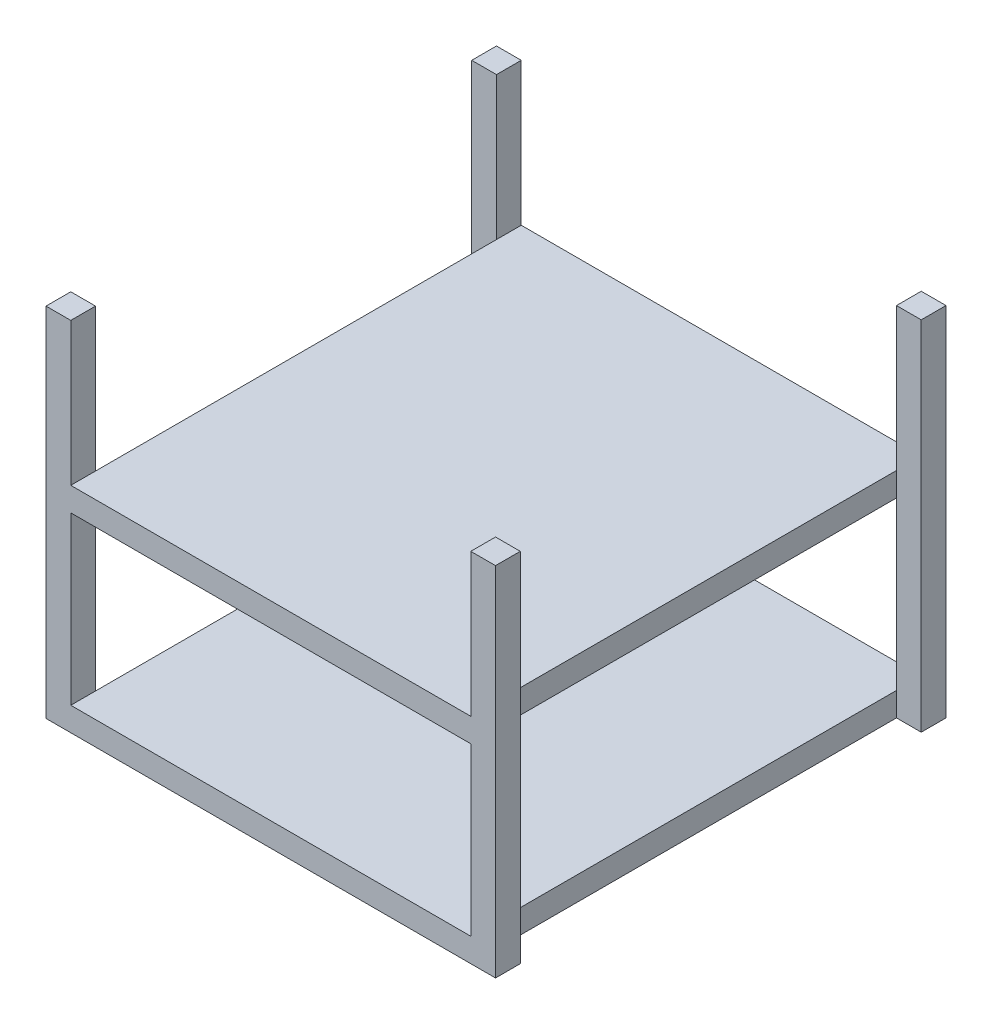
ISO-10303-21;
HEADER;
FILE_DESCRIPTION(('STEP AP214'),'2;1');
FILE_NAME('part.step','',(''),(''),'','','');
FILE_SCHEMA(('AUTOMOTIVE_DESIGN { 1 0 10303 214 1 1 1 1 }'));
ENDSEC;
DATA;
#1=APPLICATION_CONTEXT('core data for automotive mechanical design processes');
#2=APPLICATION_PROTOCOL_DEFINITION('international standard','automotive_design',2000,#1);
#3=PRODUCT_CONTEXT('',#1,'mechanical');
#4=PRODUCT('Part','Part','',(#3));
#5=PRODUCT_RELATED_PRODUCT_CATEGORY('part','',(#4));
#6=PRODUCT_DEFINITION_FORMATION('','',#4);
#7=PRODUCT_DEFINITION_CONTEXT('part definition',#1,'design');
#8=PRODUCT_DEFINITION('design','',#6,#7);
#9=PRODUCT_DEFINITION_SHAPE('','',#8);
#10=(LENGTH_UNIT() NAMED_UNIT(*) SI_UNIT(.MILLI.,.METRE.));
#11=(NAMED_UNIT(*) PLANE_ANGLE_UNIT() SI_UNIT($,.RADIAN.));
#12=(NAMED_UNIT(*) SI_UNIT($,.STERADIAN.) SOLID_ANGLE_UNIT());
#13=UNCERTAINTY_MEASURE_WITH_UNIT(LENGTH_MEASURE(1.E-05),#10,'distance_accuracy_value','');
#14=(GEOMETRIC_REPRESENTATION_CONTEXT(3) GLOBAL_UNCERTAINTY_ASSIGNED_CONTEXT((#13)) GLOBAL_UNIT_ASSIGNED_CONTEXT((#10,
#11,#12)) REPRESENTATION_CONTEXT('',''));
#15=CARTESIAN_POINT('',(0.,0.,0.));
#16=DIRECTION('',(0.,0.,1.));
#17=DIRECTION('',(1.,0.,0.));
#18=AXIS2_PLACEMENT_3D('',#15,#16,#17);
#19=CARTESIAN_POINT('',(0.,190.5,120.142));
#20=DIRECTION('',(0.,0.,1.));
#21=DIRECTION('',(1.,0.,0.));
#22=AXIS2_PLACEMENT_3D('',#19,#20,#21);
#23=PLANE('',#22);
#24=DIRECTION('',(-1.,0.,0.));
#25=VECTOR('',#24,1.);
#26=CARTESIAN_POINT('',(0.,114.3,120.142));
#27=LINE('',#26,#25);
#28=CARTESIAN_POINT('',(106.68,114.3,120.142));
#29=VERTEX_POINT('',#28);
#30=CARTESIAN_POINT('',(-106.68,114.3,120.142));
#31=VERTEX_POINT('',#30);
#32=EDGE_CURVE('E334',#29,#31,#27,.T.);
#33=ORIENTED_EDGE('',*,*,#32,.T.);
#34=DIRECTION('',(0.,1.,0.));
#35=VECTOR('',#34,1.);
#36=CARTESIAN_POINT('',(-106.68,0.,120.142));
#37=LINE('',#36,#35);
#38=CARTESIAN_POINT('',(-106.68,190.5,120.142));
#39=VERTEX_POINT('',#38);
#40=EDGE_CURVE('E341',#31,#39,#37,.T.);
#41=ORIENTED_EDGE('',*,*,#40,.T.);
#42=DIRECTION('',(-1.,0.,0.));
#43=VECTOR('',#42,1.);
#44=CARTESIAN_POINT('',(0.,190.5,120.142));
#45=LINE('',#44,#43);
#46=CARTESIAN_POINT('',(-119.888,190.5,120.142));
#47=VERTEX_POINT('',#46);
#48=EDGE_CURVE('E400',#39,#47,#45,.T.);
#49=ORIENTED_EDGE('',*,*,#48,.T.);
#50=DIRECTION('',(0.,-1.,0.));
#51=VECTOR('',#50,1.);
#52=CARTESIAN_POINT('',(-119.888,190.5,120.142));
#53=LINE('',#52,#51);
#54=CARTESIAN_POINT('',(-119.888,0.,120.142));
#55=VERTEX_POINT('',#54);
#56=EDGE_CURVE('E472',#47,#55,#53,.T.);
#57=ORIENTED_EDGE('',*,*,#56,.T.);
#58=DIRECTION('',(-1.,0.,0.));
#59=VECTOR('',#58,1.);
#60=CARTESIAN_POINT('',(0.,0.,120.142));
#61=LINE('',#60,#59);
#62=CARTESIAN_POINT('',(119.888,0.,120.142));
#63=VERTEX_POINT('',#62);
#64=EDGE_CURVE('E426',#63,#55,#61,.T.);
#65=ORIENTED_EDGE('',*,*,#64,.F.);
#66=DIRECTION('',(0.,-1.,0.));
#67=VECTOR('',#66,1.);
#68=CARTESIAN_POINT('',(119.888,190.5,120.142));
#69=LINE('',#68,#67);
#70=CARTESIAN_POINT('',(119.888,190.5,120.142));
#71=VERTEX_POINT('',#70);
#72=EDGE_CURVE('E119',#71,#63,#69,.T.);
#73=ORIENTED_EDGE('',*,*,#72,.F.);
#74=CARTESIAN_POINT('',(106.68,190.5,120.142));
#75=VERTEX_POINT('',#74);
#76=EDGE_CURVE('E402',#71,#75,#45,.T.);
#77=ORIENTED_EDGE('',*,*,#76,.T.);
#78=DIRECTION('',(0.,1.,0.));
#79=VECTOR('',#78,1.);
#80=CARTESIAN_POINT('',(106.68,0.,120.142));
#81=LINE('',#80,#79);
#82=EDGE_CURVE('E338',#29,#75,#81,.T.);
#83=ORIENTED_EDGE('',*,*,#82,.F.);
#84=EDGE_LOOP('',(#33,#41,#49,#57,#65,#73,#77,#83));
#85=FACE_BOUND('',#84,.T.);
#86=DIRECTION('',(0.,1.,0.));
#87=VECTOR('',#86,1.);
#88=CARTESIAN_POINT('',(-106.68,0.,120.142));
#89=LINE('',#88,#87);
#90=CARTESIAN_POINT('',(-106.68,12.7,120.142));
#91=VERTEX_POINT('',#90);
#92=CARTESIAN_POINT('',(-106.68,101.6,120.142));
#93=VERTEX_POINT('',#92);
#94=EDGE_CURVE('E307',#91,#93,#89,.T.);
#95=ORIENTED_EDGE('',*,*,#94,.T.);
#96=DIRECTION('',(1.,0.,0.));
#97=VECTOR('',#96,1.);
#98=CARTESIAN_POINT('',(0.,101.6,120.142));
#99=LINE('',#98,#97);
#100=CARTESIAN_POINT('',(106.68,101.6,120.142));
#101=VERTEX_POINT('',#100);
#102=EDGE_CURVE('E134',#93,#101,#99,.T.);
#103=ORIENTED_EDGE('',*,*,#102,.T.);
#104=DIRECTION('',(0.,1.,0.));
#105=VECTOR('',#104,1.);
#106=CARTESIAN_POINT('',(106.68,0.,120.142));
#107=LINE('',#106,#105);
#108=CARTESIAN_POINT('',(106.68,12.7,120.142));
#109=VERTEX_POINT('',#108);
#110=EDGE_CURVE('E314',#109,#101,#107,.T.);
#111=ORIENTED_EDGE('',*,*,#110,.F.);
#112=DIRECTION('',(1.,0.,0.));
#113=VECTOR('',#112,1.);
#114=CARTESIAN_POINT('',(0.,12.7,120.142));
#115=LINE('',#114,#113);
#116=EDGE_CURVE('E297',#91,#109,#115,.T.);
#117=ORIENTED_EDGE('',*,*,#116,.F.);
#118=EDGE_LOOP('',(#95,#103,#111,#117));
#119=FACE_BOUND('',#118,.T.);
#120=ADVANCED_FACE('F115',(#85,#119),#23,.T.);
#121=CARTESIAN_POINT('',(106.68,190.5,0.));
#122=DIRECTION('',(1.,0.,0.));
#123=DIRECTION('',(0.,0.,-1.));
#124=AXIS2_PLACEMENT_3D('',#121,#122,#123);
#125=PLANE('',#124);
#126=DIRECTION('',(0.,-1.,0.));
#127=VECTOR('',#126,1.);
#128=CARTESIAN_POINT('',(106.68,190.5,106.934));
#129=LINE('',#128,#127);
#130=CARTESIAN_POINT('',(106.68,114.3,106.934));
#131=VERTEX_POINT('',#130);
#132=CARTESIAN_POINT('',(106.68,101.6,106.934));
#133=VERTEX_POINT('',#132);
#134=EDGE_CURVE('E125',#131,#133,#129,.T.);
#135=ORIENTED_EDGE('',*,*,#134,.T.);
#136=DIRECTION('',(0.,0.,1.));
#137=VECTOR('',#136,1.);
#138=CARTESIAN_POINT('',(106.68,101.6,-184.658));
#139=LINE('',#138,#137);
#140=CARTESIAN_POINT('',(106.68,101.6,-106.934));
#141=VERTEX_POINT('',#140);
#142=EDGE_CURVE('E324',#141,#133,#139,.T.);
#143=ORIENTED_EDGE('',*,*,#142,.F.);
#144=DIRECTION('',(0.,-1.,0.));
#145=VECTOR('',#144,1.);
#146=CARTESIAN_POINT('',(106.68,190.5,-106.934));
#147=LINE('',#146,#145);
#148=CARTESIAN_POINT('',(106.68,114.3,-106.934));
#149=VERTEX_POINT('',#148);
#150=EDGE_CURVE('E473',#149,#141,#147,.T.);
#151=ORIENTED_EDGE('',*,*,#150,.F.);
#152=DIRECTION('',(0.,0.,1.));
#153=VECTOR('',#152,1.);
#154=CARTESIAN_POINT('',(106.68,114.3,-184.658));
#155=LINE('',#154,#153);
#156=EDGE_CURVE('E363',#149,#131,#155,.T.);
#157=ORIENTED_EDGE('',*,*,#156,.T.);
#158=EDGE_LOOP('',(#135,#143,#151,#157));
#159=FACE_BOUND('',#158,.T.);
#160=ADVANCED_FACE('F550',(#159),#125,.T.);
#161=DIRECTION('',(0.,0.,1.));
#162=VECTOR('',#161,1.);
#163=CARTESIAN_POINT('',(106.68,12.7,-184.658));
#164=LINE('',#163,#162);
#165=CARTESIAN_POINT('',(106.68,12.7,-106.934));
#166=VERTEX_POINT('',#165);
#167=CARTESIAN_POINT('',(106.68,12.7,106.934));
#168=VERTEX_POINT('',#167);
#169=EDGE_CURVE('E329',#166,#168,#164,.T.);
#170=ORIENTED_EDGE('',*,*,#169,.T.);
#171=CARTESIAN_POINT('',(106.68,0.,106.934));
#172=VERTEX_POINT('',#171);
#173=EDGE_CURVE('E127',#168,#172,#129,.T.);
#174=ORIENTED_EDGE('',*,*,#173,.T.);
#175=DIRECTION('',(0.,0.,1.));
#176=VECTOR('',#175,1.);
#177=CARTESIAN_POINT('',(106.68,0.,0.));
#178=LINE('',#177,#176);
#179=CARTESIAN_POINT('',(106.68,0.,-106.934));
#180=VERTEX_POINT('',#179);
#181=EDGE_CURVE('E431',#180,#172,#178,.T.);
#182=ORIENTED_EDGE('',*,*,#181,.F.);
#183=EDGE_CURVE('E467',#166,#180,#147,.T.);
#184=ORIENTED_EDGE('',*,*,#183,.F.);
#185=EDGE_LOOP('',(#170,#174,#182,#184));
#186=FACE_BOUND('',#185,.T.);
#187=ADVANCED_FACE('F614',(#186),#125,.T.);
#188=CARTESIAN_POINT('',(0.,190.5,-120.142));
#189=DIRECTION('',(0.,0.,1.));
#190=DIRECTION('',(1.,0.,0.));
#191=AXIS2_PLACEMENT_3D('',#188,#189,#190);
#192=PLANE('',#191);
#193=DIRECTION('',(0.,1.,0.));
#194=VECTOR('',#193,1.);
#195=CARTESIAN_POINT('',(-106.68,190.5,-120.142));
#196=LINE('',#195,#194);
#197=CARTESIAN_POINT('',(-106.68,114.3,-120.142));
#198=VERTEX_POINT('',#197);
#199=CARTESIAN_POINT('',(-106.68,190.5,-120.142));
#200=VERTEX_POINT('',#199);
#201=EDGE_CURVE('E364',#198,#200,#196,.T.);
#202=ORIENTED_EDGE('',*,*,#201,.F.);
#203=DIRECTION('',(-1.,0.,0.));
#204=VECTOR('',#203,1.);
#205=CARTESIAN_POINT('',(0.,114.3,-120.142));
#206=LINE('',#205,#204);
#207=CARTESIAN_POINT('',(106.68,114.3,-120.142));
#208=VERTEX_POINT('',#207);
#209=EDGE_CURVE('E385',#208,#198,#206,.T.);
#210=ORIENTED_EDGE('',*,*,#209,.F.);
#211=DIRECTION('',(0.,1.,0.));
#212=VECTOR('',#211,1.);
#213=CARTESIAN_POINT('',(106.68,190.5,-120.142));
#214=LINE('',#213,#212);
#215=CARTESIAN_POINT('',(106.68,190.5,-120.142));
#216=VERTEX_POINT('',#215);
#217=EDGE_CURVE('E373',#208,#216,#214,.T.);
#218=ORIENTED_EDGE('',*,*,#217,.T.);
#219=DIRECTION('',(-1.,0.,0.));
#220=VECTOR('',#219,1.);
#221=CARTESIAN_POINT('',(0.,190.5,-120.142));
#222=LINE('',#221,#220);
#223=CARTESIAN_POINT('',(119.888,190.5,-120.142));
#224=VERTEX_POINT('',#223);
#225=EDGE_CURVE('E414',#224,#216,#222,.T.);
#226=ORIENTED_EDGE('',*,*,#225,.F.);
#227=DIRECTION('',(0.,-1.,0.));
#228=VECTOR('',#227,1.);
#229=CARTESIAN_POINT('',(119.888,190.5,-120.142));
#230=LINE('',#229,#228);
#231=CARTESIAN_POINT('',(119.888,0.,-120.142));
#232=VERTEX_POINT('',#231);
#233=EDGE_CURVE('E460',#224,#232,#230,.T.);
#234=ORIENTED_EDGE('',*,*,#233,.T.);
#235=DIRECTION('',(-1.,0.,0.));
#236=VECTOR('',#235,1.);
#237=CARTESIAN_POINT('',(0.,0.,-120.142));
#238=LINE('',#237,#236);
#239=CARTESIAN_POINT('',(-119.888,0.,-120.142));
#240=VERTEX_POINT('',#239);
#241=EDGE_CURVE('E443',#232,#240,#238,.T.);
#242=ORIENTED_EDGE('',*,*,#241,.T.);
#243=DIRECTION('',(0.,-1.,0.));
#244=VECTOR('',#243,1.);
#245=CARTESIAN_POINT('',(-119.888,190.5,-120.142));
#246=LINE('',#245,#244);
#247=CARTESIAN_POINT('',(-119.888,190.5,-120.142));
#248=VERTEX_POINT('',#247);
#249=EDGE_CURVE('E427',#248,#240,#246,.T.);
#250=ORIENTED_EDGE('',*,*,#249,.F.);
#251=EDGE_CURVE('E413',#200,#248,#222,.T.);
#252=ORIENTED_EDGE('',*,*,#251,.F.);
#253=EDGE_LOOP('',(#202,#210,#218,#226,#234,#242,#250,#252));
#254=FACE_BOUND('',#253,.T.);
#255=DIRECTION('',(1.,0.,0.));
#256=VECTOR('',#255,1.);
#257=CARTESIAN_POINT('',(0.,101.6,-120.142));
#258=LINE('',#257,#256);
#259=CARTESIAN_POINT('',(-106.68,101.6,-120.142));
#260=VERTEX_POINT('',#259);
#261=CARTESIAN_POINT('',(106.68,101.6,-120.142));
#262=VERTEX_POINT('',#261);
#263=EDGE_CURVE('E392',#260,#262,#258,.T.);
#264=ORIENTED_EDGE('',*,*,#263,.F.);
#265=DIRECTION('',(0.,1.,0.));
#266=VECTOR('',#265,1.);
#267=CARTESIAN_POINT('',(-106.68,190.5,-120.142));
#268=LINE('',#267,#266);
#269=CARTESIAN_POINT('',(-106.68,12.7,-120.142));
#270=VERTEX_POINT('',#269);
#271=EDGE_CURVE('E370',#270,#260,#268,.T.);
#272=ORIENTED_EDGE('',*,*,#271,.F.);
#273=DIRECTION('',(1.,0.,0.));
#274=VECTOR('',#273,1.);
#275=CARTESIAN_POINT('',(0.,12.7,-120.142));
#276=LINE('',#275,#274);
#277=CARTESIAN_POINT('',(106.68,12.7,-120.142));
#278=VERTEX_POINT('',#277);
#279=EDGE_CURVE('E388',#270,#278,#276,.T.);
#280=ORIENTED_EDGE('',*,*,#279,.T.);
#281=DIRECTION('',(0.,1.,0.));
#282=VECTOR('',#281,1.);
#283=CARTESIAN_POINT('',(106.68,190.5,-120.142));
#284=LINE('',#283,#282);
#285=EDGE_CURVE('E377',#278,#262,#284,.T.);
#286=ORIENTED_EDGE('',*,*,#285,.T.);
#287=EDGE_LOOP('',(#264,#272,#280,#286));
#288=FACE_BOUND('',#287,.T.);
#289=ADVANCED_FACE('F648',(#254,#288),#192,.F.);
#290=CARTESIAN_POINT('',(-106.68,190.5,0.));
#291=DIRECTION('',(1.,0.,0.));
#292=DIRECTION('',(0.,0.,-1.));
#293=AXIS2_PLACEMENT_3D('',#290,#291,#292);
#294=PLANE('',#293);
#295=DIRECTION('',(0.,0.,1.));
#296=VECTOR('',#295,1.);
#297=CARTESIAN_POINT('',(-106.68,101.6,-184.658));
#298=LINE('',#297,#296);
#299=CARTESIAN_POINT('',(-106.68,101.6,-106.934));
#300=VERTEX_POINT('',#299);
#301=CARTESIAN_POINT('',(-106.68,101.6,106.934));
#302=VERTEX_POINT('',#301);
#303=EDGE_CURVE('E333',#300,#302,#298,.T.);
#304=ORIENTED_EDGE('',*,*,#303,.T.);
#305=DIRECTION('',(0.,-1.,0.));
#306=VECTOR('',#305,1.);
#307=CARTESIAN_POINT('',(-106.68,190.5,106.934));
#308=LINE('',#307,#306);
#309=CARTESIAN_POINT('',(-106.68,114.3,106.934));
#310=VERTEX_POINT('',#309);
#311=EDGE_CURVE('E461',#310,#302,#308,.T.);
#312=ORIENTED_EDGE('',*,*,#311,.F.);
#313=DIRECTION('',(0.,0.,1.));
#314=VECTOR('',#313,1.);
#315=CARTESIAN_POINT('',(-106.68,114.3,-184.658));
#316=LINE('',#315,#314);
#317=CARTESIAN_POINT('',(-106.68,114.3,-106.934));
#318=VERTEX_POINT('',#317);
#319=EDGE_CURVE('E349',#318,#310,#316,.T.);
#320=ORIENTED_EDGE('',*,*,#319,.F.);
#321=DIRECTION('',(0.,-1.,0.));
#322=VECTOR('',#321,1.);
#323=CARTESIAN_POINT('',(-106.68,190.5,-106.934));
#324=LINE('',#323,#322);
#325=EDGE_CURVE('E496',#318,#300,#324,.T.);
#326=ORIENTED_EDGE('',*,*,#325,.T.);
#327=EDGE_LOOP('',(#304,#312,#320,#326));
#328=FACE_BOUND('',#327,.T.);
#329=ADVANCED_FACE('F637',(#328),#294,.F.);
#330=CARTESIAN_POINT('',(-106.68,12.7,106.934));
#331=VERTEX_POINT('',#330);
#332=CARTESIAN_POINT('',(-106.68,0.,106.934));
#333=VERTEX_POINT('',#332);
#334=EDGE_CURVE('E455',#331,#333,#308,.T.);
#335=ORIENTED_EDGE('',*,*,#334,.F.);
#336=DIRECTION('',(0.,0.,1.));
#337=VECTOR('',#336,1.);
#338=CARTESIAN_POINT('',(-106.68,12.7,-184.658));
#339=LINE('',#338,#337);
#340=CARTESIAN_POINT('',(-106.68,12.7,-106.934));
#341=VERTEX_POINT('',#340);
#342=EDGE_CURVE('E300',#341,#331,#339,.T.);
#343=ORIENTED_EDGE('',*,*,#342,.F.);
#344=CARTESIAN_POINT('',(-106.68,0.,-106.934));
#345=VERTEX_POINT('',#344);
#346=EDGE_CURVE('E476',#341,#345,#324,.T.);
#347=ORIENTED_EDGE('',*,*,#346,.T.);
#348=DIRECTION('',(0.,0.,1.));
#349=VECTOR('',#348,1.);
#350=CARTESIAN_POINT('',(-106.68,0.,0.));
#351=LINE('',#350,#349);
#352=EDGE_CURVE('E446',#345,#333,#351,.T.);
#353=ORIENTED_EDGE('',*,*,#352,.T.);
#354=EDGE_LOOP('',(#335,#343,#347,#353));
#355=FACE_BOUND('',#354,.T.);
#356=ADVANCED_FACE('F587',(#355),#294,.F.);
#357=CARTESIAN_POINT('',(0.,190.5,0.));
#358=DIRECTION('',(0.,1.,0.));
#359=DIRECTION('',(0.,0.,1.));
#360=AXIS2_PLACEMENT_3D('',#357,#358,#359);
#361=PLANE('',#360);
#362=ORIENTED_EDGE('',*,*,#48,.F.);
#363=DIRECTION('',(0.,0.,1.));
#364=VECTOR('',#363,1.);
#365=CARTESIAN_POINT('',(-106.68,190.5,-184.658));
#366=LINE('',#365,#364);
#367=CARTESIAN_POINT('',(-106.68,190.5,106.934));
#368=VERTEX_POINT('',#367);
#369=EDGE_CURVE('E352',#368,#39,#366,.T.);
#370=ORIENTED_EDGE('',*,*,#369,.F.);
#371=DIRECTION('',(-1.,0.,0.));
#372=VECTOR('',#371,1.);
#373=CARTESIAN_POINT('',(0.,190.5,106.934));
#374=LINE('',#373,#372);
#375=CARTESIAN_POINT('',(-119.888,190.5,106.934));
#376=VERTEX_POINT('',#375);
#377=EDGE_CURVE('E418',#368,#376,#374,.T.);
#378=ORIENTED_EDGE('',*,*,#377,.T.);
#379=DIRECTION('',(0.,0.,-1.));
#380=VECTOR('',#379,1.);
#381=CARTESIAN_POINT('',(-119.888,190.5,0.));
#382=LINE('',#381,#380);
#383=EDGE_CURVE('E396',#47,#376,#382,.T.);
#384=ORIENTED_EDGE('',*,*,#383,.F.);
#385=EDGE_LOOP('',(#362,#370,#378,#384));
#386=FACE_BOUND('',#385,.T.);
#387=ADVANCED_FACE('F574',(#386),#361,.T.);
#388=DIRECTION('',(-1.,0.,0.));
#389=VECTOR('',#388,1.);
#390=CARTESIAN_POINT('',(-106.68,190.5,-106.934));
#391=LINE('',#390,#389);
#392=CARTESIAN_POINT('',(-106.68,190.5,-106.934));
#393=VERTEX_POINT('',#392);
#394=CARTESIAN_POINT('',(-119.888,190.5,-106.934));
#395=VERTEX_POINT('',#394);
#396=EDGE_CURVE('E480',#393,#395,#391,.T.);
#397=ORIENTED_EDGE('',*,*,#396,.F.);
#398=EDGE_CURVE('E350',#200,#393,#366,.T.);
#399=ORIENTED_EDGE('',*,*,#398,.F.);
#400=ORIENTED_EDGE('',*,*,#251,.T.);
#401=DIRECTION('',(0.,0.,1.));
#402=VECTOR('',#401,1.);
#403=CARTESIAN_POINT('',(-119.888,190.5,-120.142));
#404=LINE('',#403,#402);
#405=EDGE_CURVE('E477',#248,#395,#404,.T.);
#406=ORIENTED_EDGE('',*,*,#405,.T.);
#407=EDGE_LOOP('',(#397,#399,#400,#406));
#408=FACE_BOUND('',#407,.T.);
#409=ADVANCED_FACE('F646',(#408),#361,.T.);
#410=DIRECTION('',(0.,0.,1.));
#411=VECTOR('',#410,1.);
#412=CARTESIAN_POINT('',(106.68,190.5,-184.658));
#413=LINE('',#412,#411);
#414=CARTESIAN_POINT('',(106.68,190.5,106.934));
#415=VERTEX_POINT('',#414);
#416=EDGE_CURVE('E356',#415,#75,#413,.T.);
#417=ORIENTED_EDGE('',*,*,#416,.T.);
#418=ORIENTED_EDGE('',*,*,#76,.F.);
#419=DIRECTION('',(0.,0.,-1.));
#420=VECTOR('',#419,1.);
#421=CARTESIAN_POINT('',(119.888,190.5,120.142));
#422=LINE('',#421,#420);
#423=CARTESIAN_POINT('',(119.888,190.5,106.934));
#424=VERTEX_POINT('',#423);
#425=EDGE_CURVE('E502',#71,#424,#422,.T.);
#426=ORIENTED_EDGE('',*,*,#425,.T.);
#427=DIRECTION('',(1.,0.,0.));
#428=VECTOR('',#427,1.);
#429=CARTESIAN_POINT('',(106.68,190.5,106.934));
#430=LINE('',#429,#428);
#431=EDGE_CURVE('E505',#415,#424,#430,.T.);
#432=ORIENTED_EDGE('',*,*,#431,.F.);
#433=EDGE_LOOP('',(#417,#418,#426,#432));
#434=FACE_BOUND('',#433,.T.);
#435=ADVANCED_FACE('F558',(#434),#361,.T.);
#436=CARTESIAN_POINT('',(0.,190.5,-106.934));
#437=DIRECTION('',(0.,0.,-1.));
#438=DIRECTION('',(-1.,0.,0.));
#439=AXIS2_PLACEMENT_3D('',#436,#437,#438);
#440=PLANE('',#439);
#441=DIRECTION('',(1.,0.,0.));
#442=VECTOR('',#441,1.);
#443=CARTESIAN_POINT('',(0.,0.,-106.934));
#444=LINE('',#443,#442);
#445=CARTESIAN_POINT('',(119.888,0.,-106.934));
#446=VERTEX_POINT('',#445);
#447=EDGE_CURVE('E435',#180,#446,#444,.T.);
#448=ORIENTED_EDGE('',*,*,#447,.T.);
#449=DIRECTION('',(0.,-1.,0.));
#450=VECTOR('',#449,1.);
#451=CARTESIAN_POINT('',(119.888,190.5,-106.934));
#452=LINE('',#451,#450);
#453=CARTESIAN_POINT('',(119.888,190.5,-106.934));
#454=VERTEX_POINT('',#453);
#455=EDGE_CURVE('E464',#454,#446,#452,.T.);
#456=ORIENTED_EDGE('',*,*,#455,.F.);
#457=DIRECTION('',(1.,0.,0.));
#458=VECTOR('',#457,1.);
#459=CARTESIAN_POINT('',(0.,190.5,-106.934));
#460=LINE('',#459,#458);
#461=CARTESIAN_POINT('',(106.68,190.5,-106.934));
#462=VERTEX_POINT('',#461);
#463=EDGE_CURVE('E406',#462,#454,#460,.T.);
#464=ORIENTED_EDGE('',*,*,#463,.F.);
#465=EDGE_CURVE('E468',#462,#149,#147,.T.);
#466=ORIENTED_EDGE('',*,*,#465,.T.);
#467=ORIENTED_EDGE('',*,*,#150,.T.);
#468=DIRECTION('',(0.,-1.,0.));
#469=VECTOR('',#468,1.);
#470=CARTESIAN_POINT('',(106.68,190.5,-106.934));
#471=LINE('',#470,#469);
#472=EDGE_CURVE('E381',#141,#166,#471,.T.);
#473=ORIENTED_EDGE('',*,*,#472,.T.);
#474=ORIENTED_EDGE('',*,*,#183,.T.);
#475=EDGE_LOOP('',(#448,#456,#464,#466,#467,#473,#474));
#476=FACE_BOUND('',#475,.T.);
#477=ADVANCED_FACE('F612',(#476),#440,.F.);
#478=CARTESIAN_POINT('',(119.888,190.5,0.));
#479=DIRECTION('',(1.,0.,0.));
#480=DIRECTION('',(0.,0.,-1.));
#481=AXIS2_PLACEMENT_3D('',#478,#479,#480);
#482=PLANE('',#481);
#483=DIRECTION('',(0.,0.,1.));
#484=VECTOR('',#483,1.);
#485=CARTESIAN_POINT('',(119.888,0.,0.));
#486=LINE('',#485,#484);
#487=EDGE_CURVE('E439',#232,#446,#486,.T.);
#488=ORIENTED_EDGE('',*,*,#487,.F.);
#489=ORIENTED_EDGE('',*,*,#233,.F.);
#490=DIRECTION('',(0.,0.,1.));
#491=VECTOR('',#490,1.);
#492=CARTESIAN_POINT('',(119.888,190.5,0.));
#493=LINE('',#492,#491);
#494=EDGE_CURVE('E409',#224,#454,#493,.T.);
#495=ORIENTED_EDGE('',*,*,#494,.T.);
#496=ORIENTED_EDGE('',*,*,#455,.T.);
#497=EDGE_LOOP('',(#488,#489,#495,#496));
#498=FACE_BOUND('',#497,.T.);
#499=ADVANCED_FACE('F606',(#498),#482,.T.);
#500=CARTESIAN_POINT('',(0.,190.5,106.934));
#501=DIRECTION('',(0.,0.,1.));
#502=DIRECTION('',(1.,0.,0.));
#503=AXIS2_PLACEMENT_3D('',#500,#501,#502);
#504=PLANE('',#503);
#505=DIRECTION('',(-1.,0.,0.));
#506=VECTOR('',#505,1.);
#507=CARTESIAN_POINT('',(0.,0.,106.934));
#508=LINE('',#507,#506);
#509=CARTESIAN_POINT('',(-119.888,0.,106.934));
#510=VERTEX_POINT('',#509);
#511=EDGE_CURVE('E401',#333,#510,#508,.T.);
#512=ORIENTED_EDGE('',*,*,#511,.T.);
#513=DIRECTION('',(0.,-1.,0.));
#514=VECTOR('',#513,1.);
#515=CARTESIAN_POINT('',(-119.888,190.5,106.934));
#516=LINE('',#515,#514);
#517=EDGE_CURVE('E421',#376,#510,#516,.T.);
#518=ORIENTED_EDGE('',*,*,#517,.F.);
#519=ORIENTED_EDGE('',*,*,#377,.F.);
#520=EDGE_CURVE('E456',#368,#310,#308,.T.);
#521=ORIENTED_EDGE('',*,*,#520,.T.);
#522=ORIENTED_EDGE('',*,*,#311,.T.);
#523=DIRECTION('',(0.,1.,0.));
#524=VECTOR('',#523,1.);
#525=CARTESIAN_POINT('',(-106.68,190.5,106.934));
#526=LINE('',#525,#524);
#527=EDGE_CURVE('E367',#331,#302,#526,.T.);
#528=ORIENTED_EDGE('',*,*,#527,.F.);
#529=ORIENTED_EDGE('',*,*,#334,.T.);
#530=EDGE_LOOP('',(#512,#518,#519,#521,#522,#528,#529));
#531=FACE_BOUND('',#530,.T.);
#532=ADVANCED_FACE('F578',(#531),#504,.F.);
#533=CARTESIAN_POINT('',(-119.888,190.5,0.));
#534=DIRECTION('',(-1.,0.,0.));
#535=DIRECTION('',(0.,0.,1.));
#536=AXIS2_PLACEMENT_3D('',#533,#534,#535);
#537=PLANE('',#536);
#538=DIRECTION('',(0.,0.,-1.));
#539=VECTOR('',#538,1.);
#540=CARTESIAN_POINT('',(-119.888,0.,0.));
#541=LINE('',#540,#539);
#542=EDGE_CURVE('E422',#55,#510,#541,.T.);
#543=ORIENTED_EDGE('',*,*,#542,.F.);
#544=ORIENTED_EDGE('',*,*,#56,.F.);
#545=ORIENTED_EDGE('',*,*,#383,.T.);
#546=ORIENTED_EDGE('',*,*,#517,.T.);
#547=EDGE_LOOP('',(#543,#544,#545,#546));
#548=FACE_BOUND('',#547,.T.);
#549=ADVANCED_FACE('F582',(#548),#537,.T.);
#550=CARTESIAN_POINT('',(0.,0.,0.));
#551=DIRECTION('',(0.,1.,0.));
#552=DIRECTION('',(0.,0.,1.));
#553=AXIS2_PLACEMENT_3D('',#550,#551,#552);
#554=PLANE('',#553);
#555=ORIENTED_EDGE('',*,*,#542,.T.);
#556=ORIENTED_EDGE('',*,*,#511,.F.);
#557=ORIENTED_EDGE('',*,*,#352,.F.);
#558=DIRECTION('',(-1.,0.,0.));
#559=VECTOR('',#558,1.);
#560=CARTESIAN_POINT('',(-106.68,0.,-106.934));
#561=LINE('',#560,#559);
#562=CARTESIAN_POINT('',(-119.888,0.,-106.934));
#563=VERTEX_POINT('',#562);
#564=EDGE_CURVE('E481',#345,#563,#561,.T.);
#565=ORIENTED_EDGE('',*,*,#564,.T.);
#566=DIRECTION('',(0.,0.,1.));
#567=VECTOR('',#566,1.);
#568=CARTESIAN_POINT('',(-119.888,0.,-120.142));
#569=LINE('',#568,#567);
#570=EDGE_CURVE('E486',#240,#563,#569,.T.);
#571=ORIENTED_EDGE('',*,*,#570,.F.);
#572=ORIENTED_EDGE('',*,*,#241,.F.);
#573=ORIENTED_EDGE('',*,*,#487,.T.);
#574=ORIENTED_EDGE('',*,*,#447,.F.);
#575=ORIENTED_EDGE('',*,*,#181,.T.);
#576=DIRECTION('',(1.,0.,0.));
#577=VECTOR('',#576,1.);
#578=CARTESIAN_POINT('',(106.68,0.,106.934));
#579=LINE('',#578,#577);
#580=CARTESIAN_POINT('',(119.888,0.,106.934));
#581=VERTEX_POINT('',#580);
#582=EDGE_CURVE('E506',#172,#581,#579,.T.);
#583=ORIENTED_EDGE('',*,*,#582,.T.);
#584=DIRECTION('',(0.,0.,-1.));
#585=VECTOR('',#584,1.);
#586=CARTESIAN_POINT('',(119.888,0.,120.142));
#587=LINE('',#586,#585);
#588=EDGE_CURVE('E395',#63,#581,#587,.T.);
#589=ORIENTED_EDGE('',*,*,#588,.F.);
#590=ORIENTED_EDGE('',*,*,#64,.T.);
#591=EDGE_LOOP('',(#555,#556,#557,#565,#571,#572,#573,#574,#575,#583,#589,#590));
#592=FACE_BOUND('',#591,.T.);
#593=ADVANCED_FACE('F531',(#592),#554,.F.);
#594=EDGE_CURVE('E355',#216,#462,#413,.T.);
#595=ORIENTED_EDGE('',*,*,#594,.T.);
#596=ORIENTED_EDGE('',*,*,#463,.T.);
#597=ORIENTED_EDGE('',*,*,#494,.F.);
#598=ORIENTED_EDGE('',*,*,#225,.T.);
#599=EDGE_LOOP('',(#595,#596,#597,#598));
#600=FACE_BOUND('',#599,.T.);
#601=ADVANCED_FACE('F670',(#600),#361,.T.);
#602=CARTESIAN_POINT('',(119.888,190.5,120.142));
#603=DIRECTION('',(-1.,0.,0.));
#604=DIRECTION('',(0.,0.,1.));
#605=AXIS2_PLACEMENT_3D('',#602,#603,#604);
#606=PLANE('',#605);
#607=ORIENTED_EDGE('',*,*,#588,.T.);
#608=DIRECTION('',(0.,-1.,0.));
#609=VECTOR('',#608,1.);
#610=CARTESIAN_POINT('',(119.888,190.5,106.934));
#611=LINE('',#610,#609);
#612=EDGE_CURVE('E510',#424,#581,#611,.T.);
#613=ORIENTED_EDGE('',*,*,#612,.F.);
#614=ORIENTED_EDGE('',*,*,#425,.F.);
#615=ORIENTED_EDGE('',*,*,#72,.T.);
#616=EDGE_LOOP('',(#607,#613,#614,#615));
#617=FACE_BOUND('',#616,.T.);
#618=ADVANCED_FACE('F117',(#617),#606,.F.);
#619=CARTESIAN_POINT('',(106.68,190.5,106.934));
#620=DIRECTION('',(0.,0.,-1.));
#621=DIRECTION('',(-1.,0.,0.));
#622=AXIS2_PLACEMENT_3D('',#619,#620,#621);
#623=PLANE('',#622);
#624=ORIENTED_EDGE('',*,*,#582,.F.);
#625=ORIENTED_EDGE('',*,*,#173,.F.);
#626=EDGE_CURVE('E538',#133,#168,#129,.T.);
#627=ORIENTED_EDGE('',*,*,#626,.F.);
#628=ORIENTED_EDGE('',*,*,#134,.F.);
#629=EDGE_CURVE('E12',#415,#131,#129,.T.);
#630=ORIENTED_EDGE('',*,*,#629,.F.);
#631=ORIENTED_EDGE('',*,*,#431,.T.);
#632=ORIENTED_EDGE('',*,*,#612,.T.);
#633=EDGE_LOOP('',(#624,#625,#627,#628,#630,#631,#632));
#634=FACE_BOUND('',#633,.T.);
#635=ADVANCED_FACE('F535',(#634),#623,.T.);
#636=CARTESIAN_POINT('',(-119.888,190.5,-120.142));
#637=DIRECTION('',(1.,0.,0.));
#638=DIRECTION('',(0.,0.,-1.));
#639=AXIS2_PLACEMENT_3D('',#636,#637,#638);
#640=PLANE('',#639);
#641=ORIENTED_EDGE('',*,*,#570,.T.);
#642=DIRECTION('',(0.,-1.,0.));
#643=VECTOR('',#642,1.);
#644=CARTESIAN_POINT('',(-119.888,190.5,-106.934));
#645=LINE('',#644,#643);
#646=EDGE_CURVE('E485',#395,#563,#645,.T.);
#647=ORIENTED_EDGE('',*,*,#646,.F.);
#648=ORIENTED_EDGE('',*,*,#405,.F.);
#649=ORIENTED_EDGE('',*,*,#249,.T.);
#650=EDGE_LOOP('',(#641,#647,#648,#649));
#651=FACE_BOUND('',#650,.T.);
#652=ADVANCED_FACE('F600',(#651),#640,.F.);
#653=CARTESIAN_POINT('',(-106.68,190.5,-106.934));
#654=DIRECTION('',(0.,0.,1.));
#655=DIRECTION('',(1.,0.,0.));
#656=AXIS2_PLACEMENT_3D('',#653,#654,#655);
#657=PLANE('',#656);
#658=ORIENTED_EDGE('',*,*,#564,.F.);
#659=ORIENTED_EDGE('',*,*,#346,.F.);
#660=EDGE_CURVE('E593',#300,#341,#324,.T.);
#661=ORIENTED_EDGE('',*,*,#660,.F.);
#662=ORIENTED_EDGE('',*,*,#325,.F.);
#663=EDGE_CURVE('E493',#393,#318,#324,.T.);
#664=ORIENTED_EDGE('',*,*,#663,.F.);
#665=ORIENTED_EDGE('',*,*,#396,.T.);
#666=ORIENTED_EDGE('',*,*,#646,.T.);
#667=EDGE_LOOP('',(#658,#659,#661,#662,#664,#665,#666));
#668=FACE_BOUND('',#667,.T.);
#669=ADVANCED_FACE('F594',(#668),#657,.T.);
#670=CARTESIAN_POINT('',(0.,114.3,-184.658));
#671=DIRECTION('',(0.,1.,0.));
#672=DIRECTION('',(-1.,0.,0.));
#673=AXIS2_PLACEMENT_3D('',#670,#671,#672);
#674=PLANE('',#673);
#675=ORIENTED_EDGE('',*,*,#209,.T.);
#676=EDGE_CURVE('E351',#198,#318,#316,.T.);
#677=ORIENTED_EDGE('',*,*,#676,.T.);
#678=ORIENTED_EDGE('',*,*,#319,.T.);
#679=EDGE_CURVE('E346',#310,#31,#316,.T.);
#680=ORIENTED_EDGE('',*,*,#679,.T.);
#681=ORIENTED_EDGE('',*,*,#32,.F.);
#682=EDGE_CURVE('E345',#131,#29,#155,.T.);
#683=ORIENTED_EDGE('',*,*,#682,.F.);
#684=ORIENTED_EDGE('',*,*,#156,.F.);
#685=EDGE_CURVE('E360',#208,#149,#155,.T.);
#686=ORIENTED_EDGE('',*,*,#685,.F.);
#687=EDGE_LOOP('',(#675,#677,#678,#680,#681,#683,#684,#686));
#688=FACE_BOUND('',#687,.T.);
#689=ADVANCED_FACE('F564',(#688),#674,.T.);
#690=CARTESIAN_POINT('',(106.68,0.,-184.658));
#691=DIRECTION('',(1.,0.,0.));
#692=DIRECTION('',(0.,0.,-1.));
#693=AXIS2_PLACEMENT_3D('',#690,#691,#692);
#694=PLANE('',#693);
#695=ORIENTED_EDGE('',*,*,#594,.F.);
#696=ORIENTED_EDGE('',*,*,#217,.F.);
#697=ORIENTED_EDGE('',*,*,#685,.T.);
#698=ORIENTED_EDGE('',*,*,#465,.F.);
#699=EDGE_LOOP('',(#695,#696,#697,#698));
#700=FACE_BOUND('',#699,.T.);
#701=ADVANCED_FACE('F667',(#700),#694,.F.);
#702=CARTESIAN_POINT('',(-106.68,0.,-184.658));
#703=DIRECTION('',(1.,0.,0.));
#704=DIRECTION('',(0.,0.,-1.));
#705=AXIS2_PLACEMENT_3D('',#702,#703,#704);
#706=PLANE('',#705);
#707=ORIENTED_EDGE('',*,*,#201,.T.);
#708=ORIENTED_EDGE('',*,*,#398,.T.);
#709=ORIENTED_EDGE('',*,*,#663,.T.);
#710=ORIENTED_EDGE('',*,*,#676,.F.);
#711=EDGE_LOOP('',(#707,#708,#709,#710));
#712=FACE_BOUND('',#711,.T.);
#713=ADVANCED_FACE('F672',(#712),#706,.T.);
#714=ORIENTED_EDGE('',*,*,#520,.F.);
#715=ORIENTED_EDGE('',*,*,#369,.T.);
#716=ORIENTED_EDGE('',*,*,#40,.F.);
#717=ORIENTED_EDGE('',*,*,#679,.F.);
#718=EDGE_LOOP('',(#714,#715,#716,#717));
#719=FACE_BOUND('',#718,.T.);
#720=ADVANCED_FACE('F570',(#719),#706,.T.);
#721=ORIENTED_EDGE('',*,*,#629,.T.);
#722=ORIENTED_EDGE('',*,*,#682,.T.);
#723=ORIENTED_EDGE('',*,*,#82,.T.);
#724=ORIENTED_EDGE('',*,*,#416,.F.);
#725=EDGE_LOOP('',(#721,#722,#723,#724));
#726=FACE_BOUND('',#725,.T.);
#727=ADVANCED_FACE('F559',(#726),#694,.F.);
#728=CARTESIAN_POINT('',(0.,101.6,-184.658));
#729=DIRECTION('',(0.,-1.,0.));
#730=DIRECTION('',(0.,0.,-1.));
#731=AXIS2_PLACEMENT_3D('',#728,#729,#730);
#732=PLANE('',#731);
#733=ORIENTED_EDGE('',*,*,#263,.T.);
#734=EDGE_CURVE('E326',#262,#141,#139,.T.);
#735=ORIENTED_EDGE('',*,*,#734,.T.);
#736=ORIENTED_EDGE('',*,*,#142,.T.);
#737=EDGE_CURVE('E321',#133,#101,#139,.T.);
#738=ORIENTED_EDGE('',*,*,#737,.T.);
#739=ORIENTED_EDGE('',*,*,#102,.F.);
#740=EDGE_CURVE('E309',#302,#93,#298,.T.);
#741=ORIENTED_EDGE('',*,*,#740,.F.);
#742=ORIENTED_EDGE('',*,*,#303,.F.);
#743=EDGE_CURVE('E304',#260,#300,#298,.T.);
#744=ORIENTED_EDGE('',*,*,#743,.F.);
#745=EDGE_LOOP('',(#733,#735,#736,#738,#739,#741,#742,#744));
#746=FACE_BOUND('',#745,.T.);
#747=ADVANCED_FACE('F622',(#746),#732,.T.);
#748=CARTESIAN_POINT('',(0.,12.7,-184.658));
#749=DIRECTION('',(0.,-1.,0.));
#750=DIRECTION('',(0.,0.,-1.));
#751=AXIS2_PLACEMENT_3D('',#748,#749,#750);
#752=PLANE('',#751);
#753=EDGE_CURVE('E142',#270,#341,#339,.T.);
#754=ORIENTED_EDGE('',*,*,#753,.T.);
#755=ORIENTED_EDGE('',*,*,#342,.T.);
#756=EDGE_CURVE('E292',#331,#91,#339,.T.);
#757=ORIENTED_EDGE('',*,*,#756,.T.);
#758=ORIENTED_EDGE('',*,*,#116,.T.);
#759=EDGE_CURVE('E327',#168,#109,#164,.T.);
#760=ORIENTED_EDGE('',*,*,#759,.F.);
#761=ORIENTED_EDGE('',*,*,#169,.F.);
#762=EDGE_CURVE('E325',#278,#166,#164,.T.);
#763=ORIENTED_EDGE('',*,*,#762,.F.);
#764=ORIENTED_EDGE('',*,*,#279,.F.);
#765=EDGE_LOOP('',(#754,#755,#757,#758,#760,#761,#763,#764));
#766=FACE_BOUND('',#765,.T.);
#767=ADVANCED_FACE('F294',(#766),#752,.F.);
#768=CARTESIAN_POINT('',(106.68,0.,-184.658));
#769=DIRECTION('',(1.,0.,0.));
#770=DIRECTION('',(0.,0.,-1.));
#771=AXIS2_PLACEMENT_3D('',#768,#769,#770);
#772=PLANE('',#771);
#773=ORIENTED_EDGE('',*,*,#734,.F.);
#774=ORIENTED_EDGE('',*,*,#285,.F.);
#775=ORIENTED_EDGE('',*,*,#762,.T.);
#776=ORIENTED_EDGE('',*,*,#472,.F.);
#777=EDGE_LOOP('',(#773,#774,#775,#776));
#778=FACE_BOUND('',#777,.T.);
#779=ADVANCED_FACE('F620',(#778),#772,.F.);
#780=CARTESIAN_POINT('',(-106.68,0.,-184.658));
#781=DIRECTION('',(1.,0.,0.));
#782=DIRECTION('',(0.,0.,-1.));
#783=AXIS2_PLACEMENT_3D('',#780,#781,#782);
#784=PLANE('',#783);
#785=ORIENTED_EDGE('',*,*,#271,.T.);
#786=ORIENTED_EDGE('',*,*,#743,.T.);
#787=ORIENTED_EDGE('',*,*,#660,.T.);
#788=ORIENTED_EDGE('',*,*,#753,.F.);
#789=EDGE_LOOP('',(#785,#786,#787,#788));
#790=FACE_BOUND('',#789,.T.);
#791=ADVANCED_FACE('F675',(#790),#784,.T.);
#792=ORIENTED_EDGE('',*,*,#527,.T.);
#793=ORIENTED_EDGE('',*,*,#740,.T.);
#794=ORIENTED_EDGE('',*,*,#94,.F.);
#795=ORIENTED_EDGE('',*,*,#756,.F.);
#796=EDGE_LOOP('',(#792,#793,#794,#795));
#797=FACE_BOUND('',#796,.T.);
#798=ADVANCED_FACE('F308',(#797),#784,.T.);
#799=ORIENTED_EDGE('',*,*,#626,.T.);
#800=ORIENTED_EDGE('',*,*,#759,.T.);
#801=ORIENTED_EDGE('',*,*,#110,.T.);
#802=ORIENTED_EDGE('',*,*,#737,.F.);
#803=EDGE_LOOP('',(#799,#800,#801,#802));
#804=FACE_BOUND('',#803,.T.);
#805=ADVANCED_FACE('F654',(#804),#772,.F.);
#806=CLOSED_SHELL('',(#120,#160,#187,#289,#329,#356,#387,#409,#435,#477,#499,#532,#549,#593,
#601,#618,#635,#652,#669,#689,#701,#713,#720,#727,#747,#767,#779,#791,#798,#805));
#807=MANIFOLD_SOLID_BREP('B2',#806);
#808=ADVANCED_BREP_SHAPE_REPRESENTATION('',(#18,#807),#14);
#809=SHAPE_DEFINITION_REPRESENTATION(#9,#808);
ENDSEC;
END-ISO-10303-21;
